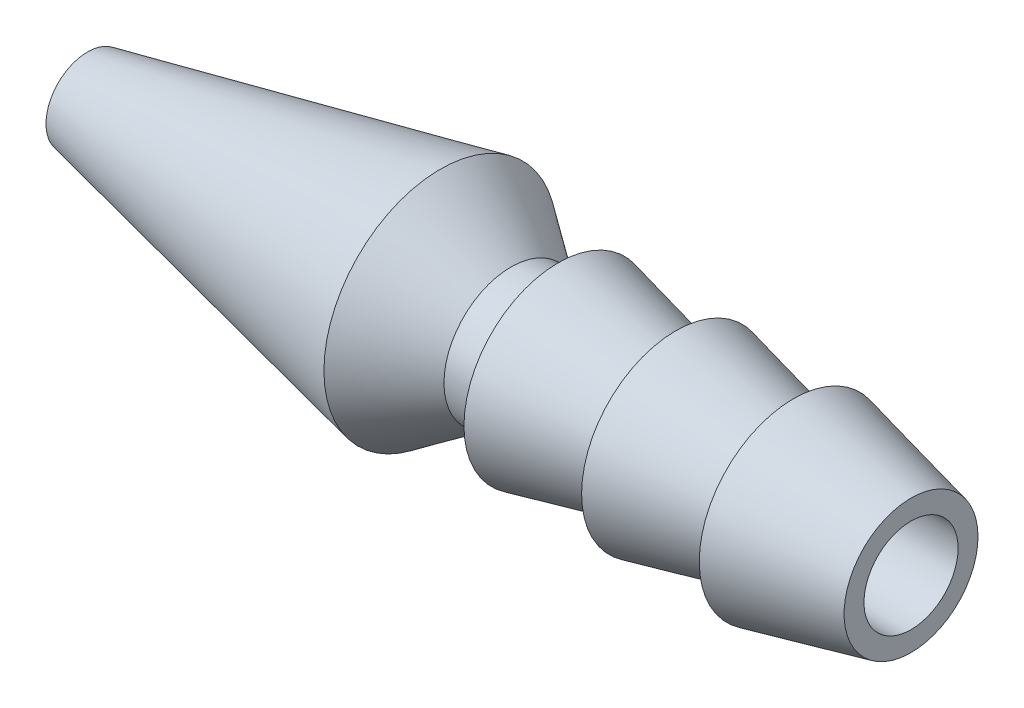
ISO-10303-21;
HEADER;
FILE_DESCRIPTION(('STEP AP214'),'2;1');
FILE_NAME('part.step','',(''),(''),'','','');
FILE_SCHEMA(('AUTOMOTIVE_DESIGN { 1 0 10303 214 1 1 1 1 }'));
ENDSEC;
DATA;
#1=APPLICATION_CONTEXT('core data for automotive mechanical design processes');
#2=APPLICATION_PROTOCOL_DEFINITION('international standard','automotive_design',2000,#1);
#3=PRODUCT_CONTEXT('',#1,'mechanical');
#4=PRODUCT('Part','Part','',(#3));
#5=PRODUCT_RELATED_PRODUCT_CATEGORY('part','',(#4));
#6=PRODUCT_DEFINITION_FORMATION('','',#4);
#7=PRODUCT_DEFINITION_CONTEXT('part definition',#1,'design');
#8=PRODUCT_DEFINITION('design','',#6,#7);
#9=PRODUCT_DEFINITION_SHAPE('','',#8);
#10=(LENGTH_UNIT() NAMED_UNIT(*) SI_UNIT(.MILLI.,.METRE.));
#11=(NAMED_UNIT(*) PLANE_ANGLE_UNIT() SI_UNIT($,.RADIAN.));
#12=(NAMED_UNIT(*) SI_UNIT($,.STERADIAN.) SOLID_ANGLE_UNIT());
#13=UNCERTAINTY_MEASURE_WITH_UNIT(LENGTH_MEASURE(1.E-05),#10,'distance_accuracy_value','');
#14=(GEOMETRIC_REPRESENTATION_CONTEXT(3) GLOBAL_UNCERTAINTY_ASSIGNED_CONTEXT((#13)) GLOBAL_UNIT_ASSIGNED_CONTEXT((#10,
#11,#12)) REPRESENTATION_CONTEXT('',''));
#15=CARTESIAN_POINT('',(0.,0.,0.));
#16=DIRECTION('',(0.,0.,1.));
#17=DIRECTION('',(1.,0.,0.));
#18=AXIS2_PLACEMENT_3D('',#15,#16,#17);
#19=CARTESIAN_POINT('',(0.,0.,0.));
#20=DIRECTION('',(-1.,0.,0.));
#21=DIRECTION('',(0.,0.,-1.));
#22=AXIS2_PLACEMENT_3D('',#19,#20,#21);
#23=CONICAL_SURFACE('',#22,4.,0.226892802759263);
#24=CARTESIAN_POINT('',(5.,0.,0.));
#25=DIRECTION('',(1.,0.,0.));
#26=DIRECTION('',(0.,0.,-1.));
#27=AXIS2_PLACEMENT_3D('',#24,#25,#26);
#28=CIRCLE('',#27,2.84565904437218);
#29=CARTESIAN_POINT('',(5.,0.,-2.84565904437218));
#30=VERTEX_POINT('',#29);
#31=EDGE_CURVE('E42',#30,#30,#28,.T.);
#32=ORIENTED_EDGE('',*,*,#31,.F.);
#33=EDGE_LOOP('',(#32));
#34=FACE_BOUND('',#33,.T.);
#35=CARTESIAN_POINT('',(0.,0.,0.));
#36=DIRECTION('',(1.,0.,0.));
#37=DIRECTION('',(0.,0.,-1.));
#38=AXIS2_PLACEMENT_3D('',#35,#36,#37);
#39=CIRCLE('',#38,4.);
#40=CARTESIAN_POINT('',(0.,0.,-4.));
#41=VERTEX_POINT('',#40);
#42=EDGE_CURVE('E47',#41,#41,#39,.T.);
#43=ORIENTED_EDGE('',*,*,#42,.T.);
#44=EDGE_LOOP('',(#43));
#45=FACE_BOUND('',#44,.T.);
#46=ADVANCED_FACE('F33',(#34,#45),#23,.T.);
#47=CARTESIAN_POINT('',(0.,0.,0.));
#48=DIRECTION('',(1.,0.,0.));
#49=DIRECTION('',(0.,0.,-1.));
#50=AXIS2_PLACEMENT_3D('',#47,#48,#49);
#51=PLANE('',#50);
#52=CARTESIAN_POINT('',(0.,0.,0.));
#53=DIRECTION('',(-1.,0.,0.));
#54=DIRECTION('',(0.,0.,1.));
#55=AXIS2_PLACEMENT_3D('',#52,#53,#54);
#56=CIRCLE('',#55,2.85);
#57=CARTESIAN_POINT('',(0.,0.,2.85));
#58=VERTEX_POINT('',#57);
#59=EDGE_CURVE('E10',#58,#58,#56,.T.);
#60=ORIENTED_EDGE('',*,*,#59,.F.);
#61=EDGE_LOOP('',(#60));
#62=FACE_BOUND('',#61,.T.);
#63=ORIENTED_EDGE('',*,*,#42,.F.);
#64=EDGE_LOOP('',(#63));
#65=FACE_BOUND('',#64,.T.);
#66=ADVANCED_FACE('F133',(#62,#65),#51,.F.);
#67=CARTESIAN_POINT('',(5.,0.,0.));
#68=DIRECTION('',(-1.,0.,0.));
#69=DIRECTION('',(0.,0.,-1.));
#70=AXIS2_PLACEMENT_3D('',#67,#68,#69);
#71=CONICAL_SURFACE('',#70,4.,0.226892802759263);
#72=CARTESIAN_POINT('',(10.,0.,0.));
#73=DIRECTION('',(1.,0.,0.));
#74=DIRECTION('',(0.,0.,-1.));
#75=AXIS2_PLACEMENT_3D('',#72,#73,#74);
#76=CIRCLE('',#75,2.84565904437218);
#77=CARTESIAN_POINT('',(10.,0.,-2.84565904437218));
#78=VERTEX_POINT('',#77);
#79=EDGE_CURVE('E62',#78,#78,#76,.T.);
#80=ORIENTED_EDGE('',*,*,#79,.F.);
#81=EDGE_LOOP('',(#80));
#82=FACE_BOUND('',#81,.T.);
#83=CARTESIAN_POINT('',(5.,0.,0.));
#84=DIRECTION('',(1.,0.,0.));
#85=DIRECTION('',(0.,0.,-1.));
#86=AXIS2_PLACEMENT_3D('',#83,#84,#85);
#87=CIRCLE('',#86,4.);
#88=CARTESIAN_POINT('',(5.,0.,-4.));
#89=VERTEX_POINT('',#88);
#90=EDGE_CURVE('E59',#89,#89,#87,.T.);
#91=ORIENTED_EDGE('',*,*,#90,.T.);
#92=EDGE_LOOP('',(#91));
#93=FACE_BOUND('',#92,.T.);
#94=ADVANCED_FACE('F130',(#82,#93),#71,.T.);
#95=CARTESIAN_POINT('',(5.,0.,0.));
#96=DIRECTION('',(1.,0.,0.));
#97=DIRECTION('',(0.,0.,-1.));
#98=AXIS2_PLACEMENT_3D('',#95,#96,#97);
#99=PLANE('',#98);
#100=ORIENTED_EDGE('',*,*,#31,.T.);
#101=EDGE_LOOP('',(#100));
#102=FACE_BOUND('',#101,.T.);
#103=ORIENTED_EDGE('',*,*,#90,.F.);
#104=EDGE_LOOP('',(#103));
#105=FACE_BOUND('',#104,.T.);
#106=ADVANCED_FACE('F126',(#102,#105),#99,.F.);
#107=CARTESIAN_POINT('',(10.,0.,0.));
#108=DIRECTION('',(-1.,0.,0.));
#109=DIRECTION('',(0.,0.,-1.));
#110=AXIS2_PLACEMENT_3D('',#107,#108,#109);
#111=CONICAL_SURFACE('',#110,4.,0.226892802759263);
#112=CARTESIAN_POINT('',(15.,0.,0.));
#113=DIRECTION('',(1.,0.,0.));
#114=DIRECTION('',(0.,0.,-1.));
#115=AXIS2_PLACEMENT_3D('',#112,#113,#114);
#116=CIRCLE('',#115,2.84565904437218);
#117=CARTESIAN_POINT('',(15.,0.,-2.84565904437218));
#118=VERTEX_POINT('',#117);
#119=EDGE_CURVE('E56',#118,#118,#116,.T.);
#120=ORIENTED_EDGE('',*,*,#119,.F.);
#121=EDGE_LOOP('',(#120));
#122=FACE_BOUND('',#121,.T.);
#123=CARTESIAN_POINT('',(10.,0.,0.));
#124=DIRECTION('',(1.,0.,0.));
#125=DIRECTION('',(0.,0.,-1.));
#126=AXIS2_PLACEMENT_3D('',#123,#124,#125);
#127=CIRCLE('',#126,4.);
#128=CARTESIAN_POINT('',(10.,0.,-4.));
#129=VERTEX_POINT('',#128);
#130=EDGE_CURVE('E53',#129,#129,#127,.T.);
#131=ORIENTED_EDGE('',*,*,#130,.T.);
#132=EDGE_LOOP('',(#131));
#133=FACE_BOUND('',#132,.T.);
#134=ADVANCED_FACE('F119',(#122,#133),#111,.T.);
#135=CARTESIAN_POINT('',(15.,0.,0.));
#136=DIRECTION('',(1.,0.,0.));
#137=DIRECTION('',(0.,0.,-1.));
#138=AXIS2_PLACEMENT_3D('',#135,#136,#137);
#139=PLANE('',#138);
#140=CARTESIAN_POINT('',(15.,0.,0.));
#141=DIRECTION('',(1.,0.,0.));
#142=DIRECTION('',(0.,0.,-1.));
#143=AXIS2_PLACEMENT_3D('',#140,#141,#142);
#144=CIRCLE('',#143,2.);
#145=CARTESIAN_POINT('',(15.,0.,-2.));
#146=VERTEX_POINT('',#145);
#147=EDGE_CURVE('E74',#146,#146,#144,.T.);
#148=ORIENTED_EDGE('',*,*,#147,.F.);
#149=EDGE_LOOP('',(#148));
#150=FACE_BOUND('',#149,.T.);
#151=ORIENTED_EDGE('',*,*,#119,.T.);
#152=EDGE_LOOP('',(#151));
#153=FACE_BOUND('',#152,.T.);
#154=ADVANCED_FACE('F116',(#150,#153),#139,.T.);
#155=CARTESIAN_POINT('',(10.,0.,0.));
#156=DIRECTION('',(1.,0.,0.));
#157=DIRECTION('',(0.,0.,-1.));
#158=AXIS2_PLACEMENT_3D('',#155,#156,#157);
#159=PLANE('',#158);
#160=ORIENTED_EDGE('',*,*,#79,.T.);
#161=EDGE_LOOP('',(#160));
#162=FACE_BOUND('',#161,.T.);
#163=ORIENTED_EDGE('',*,*,#130,.F.);
#164=EDGE_LOOP('',(#163));
#165=FACE_BOUND('',#164,.T.);
#166=ADVANCED_FACE('F114',(#162,#165),#159,.F.);
#167=CARTESIAN_POINT('',(-2.,0.,0.));
#168=DIRECTION('',(1.,0.,0.));
#169=DIRECTION('',(0.,0.,-1.));
#170=AXIS2_PLACEMENT_3D('',#167,#168,#169);
#171=CYLINDRICAL_SURFACE('',#170,2.85);
#172=CARTESIAN_POINT('',(-2.,0.,0.));
#173=DIRECTION('',(-1.,0.,0.));
#174=DIRECTION('',(0.,0.,1.));
#175=AXIS2_PLACEMENT_3D('',#172,#173,#174);
#176=CIRCLE('',#175,2.85);
#177=CARTESIAN_POINT('',(-2.,0.,2.85));
#178=VERTEX_POINT('',#177);
#179=EDGE_CURVE('E51',#178,#178,#176,.T.);
#180=ORIENTED_EDGE('',*,*,#179,.F.);
#181=EDGE_LOOP('',(#180));
#182=FACE_BOUND('',#181,.T.);
#183=ORIENTED_EDGE('',*,*,#59,.T.);
#184=EDGE_LOOP('',(#183));
#185=FACE_BOUND('',#184,.T.);
#186=ADVANCED_FACE('F110',(#182,#185),#171,.T.);
#187=CARTESIAN_POINT('',(-2.,0.,0.));
#188=DIRECTION('',(-1.,0.,0.));
#189=DIRECTION('',(0.,0.,1.));
#190=AXIS2_PLACEMENT_3D('',#187,#188,#189);
#191=CONICAL_SURFACE('',#190,2.85,0.610865238198016);
#192=CARTESIAN_POINT('',(-5.,0.,0.));
#193=DIRECTION('',(-1.,0.,0.));
#194=DIRECTION('',(0.,0.,1.));
#195=AXIS2_PLACEMENT_3D('',#192,#193,#194);
#196=CIRCLE('',#195,4.95062261462913);
#197=CARTESIAN_POINT('',(-5.,0.,4.95062261462913));
#198=VERTEX_POINT('',#197);
#199=EDGE_CURVE('E234',#198,#198,#196,.T.);
#200=ORIENTED_EDGE('',*,*,#199,.F.);
#201=EDGE_LOOP('',(#200));
#202=FACE_BOUND('',#201,.T.);
#203=ORIENTED_EDGE('',*,*,#179,.T.);
#204=EDGE_LOOP('',(#203));
#205=FACE_BOUND('',#204,.T.);
#206=ADVANCED_FACE('F106',(#202,#205),#191,.T.);
#207=CARTESIAN_POINT('',(-5.,0.,0.));
#208=DIRECTION('',(1.,0.,0.));
#209=DIRECTION('',(0.,0.,1.));
#210=AXIS2_PLACEMENT_3D('',#207,#208,#209);
#211=CONICAL_SURFACE('',#210,4.95062261462913,0.20943951023932);
#212=CARTESIAN_POINT('',(-20.,0.,0.));
#213=DIRECTION('',(-1.,0.,0.));
#214=DIRECTION('',(0.,0.,1.));
#215=AXIS2_PLACEMENT_3D('',#212,#213,#214);
#216=CIRCLE('',#215,1.7622741895788);
#217=CARTESIAN_POINT('',(-20.,0.,1.7622741895788));
#218=VERTEX_POINT('',#217);
#219=EDGE_CURVE('E77',#218,#218,#216,.T.);
#220=ORIENTED_EDGE('',*,*,#219,.F.);
#221=EDGE_LOOP('',(#220));
#222=FACE_BOUND('',#221,.T.);
#223=ORIENTED_EDGE('',*,*,#199,.T.);
#224=EDGE_LOOP('',(#223));
#225=FACE_BOUND('',#224,.T.);
#226=ADVANCED_FACE('F102',(#222,#225),#211,.T.);
#227=CARTESIAN_POINT('',(-20.,0.,0.));
#228=DIRECTION('',(-1.,0.,0.));
#229=DIRECTION('',(0.,0.,1.));
#230=AXIS2_PLACEMENT_3D('',#227,#228,#229);
#231=PLANE('',#230);
#232=CARTESIAN_POINT('',(-20.,0.,0.));
#233=DIRECTION('',(-1.,0.,0.));
#234=DIRECTION('',(0.,0.,1.));
#235=AXIS2_PLACEMENT_3D('',#232,#233,#234);
#236=CIRCLE('',#235,1.);
#237=CARTESIAN_POINT('',(-20.,0.,1.));
#238=VERTEX_POINT('',#237);
#239=EDGE_CURVE('E75',#238,#238,#236,.T.);
#240=ORIENTED_EDGE('',*,*,#239,.F.);
#241=EDGE_LOOP('',(#240));
#242=FACE_BOUND('',#241,.T.);
#243=ORIENTED_EDGE('',*,*,#219,.T.);
#244=EDGE_LOOP('',(#243));
#245=FACE_BOUND('',#244,.T.);
#246=ADVANCED_FACE('F99',(#242,#245),#231,.T.);
#247=CARTESIAN_POINT('',(-5.,0.,0.));
#248=DIRECTION('',(1.,0.,0.));
#249=DIRECTION('',(0.,0.,-1.));
#250=AXIS2_PLACEMENT_3D('',#247,#248,#249);
#251=CYLINDRICAL_SURFACE('',#250,2.);
#252=CARTESIAN_POINT('',(-5.,0.,0.));
#253=DIRECTION('',(-1.,0.,0.));
#254=DIRECTION('',(0.,0.,-1.));
#255=AXIS2_PLACEMENT_3D('',#252,#253,#254);
#256=CIRCLE('',#255,2.);
#257=CARTESIAN_POINT('',(-5.,0.,-2.));
#258=VERTEX_POINT('',#257);
#259=EDGE_CURVE('E69',#258,#258,#256,.T.);
#260=ORIENTED_EDGE('',*,*,#259,.T.);
#261=EDGE_LOOP('',(#260));
#262=FACE_BOUND('',#261,.T.);
#263=ORIENTED_EDGE('',*,*,#147,.T.);
#264=EDGE_LOOP('',(#263));
#265=FACE_BOUND('',#264,.T.);
#266=ADVANCED_FACE('F70',(#262,#265),#251,.F.);
#267=CARTESIAN_POINT('',(-20.,0.,0.));
#268=DIRECTION('',(1.,0.,0.));
#269=DIRECTION('',(0.,0.,1.));
#270=AXIS2_PLACEMENT_3D('',#267,#268,#269);
#271=CONICAL_SURFACE('',#270,1.,0.0663225115757848);
#272=ORIENTED_EDGE('',*,*,#259,.F.);
#273=EDGE_LOOP('',(#272));
#274=FACE_BOUND('',#273,.T.);
#275=ORIENTED_EDGE('',*,*,#239,.T.);
#276=EDGE_LOOP('',(#275));
#277=FACE_BOUND('',#276,.T.);
#278=ADVANCED_FACE('F88',(#274,#277),#271,.F.);
#279=CLOSED_SHELL('',(#46,#66,#94,#106,#134,#154,#166,#186,#206,#226,#246,#266,#278));
#280=MANIFOLD_SOLID_BREP('B2',#279);
#281=ADVANCED_BREP_SHAPE_REPRESENTATION('',(#18,#280),#14);
#282=SHAPE_DEFINITION_REPRESENTATION(#9,#281);
ENDSEC;
END-ISO-10303-21;
